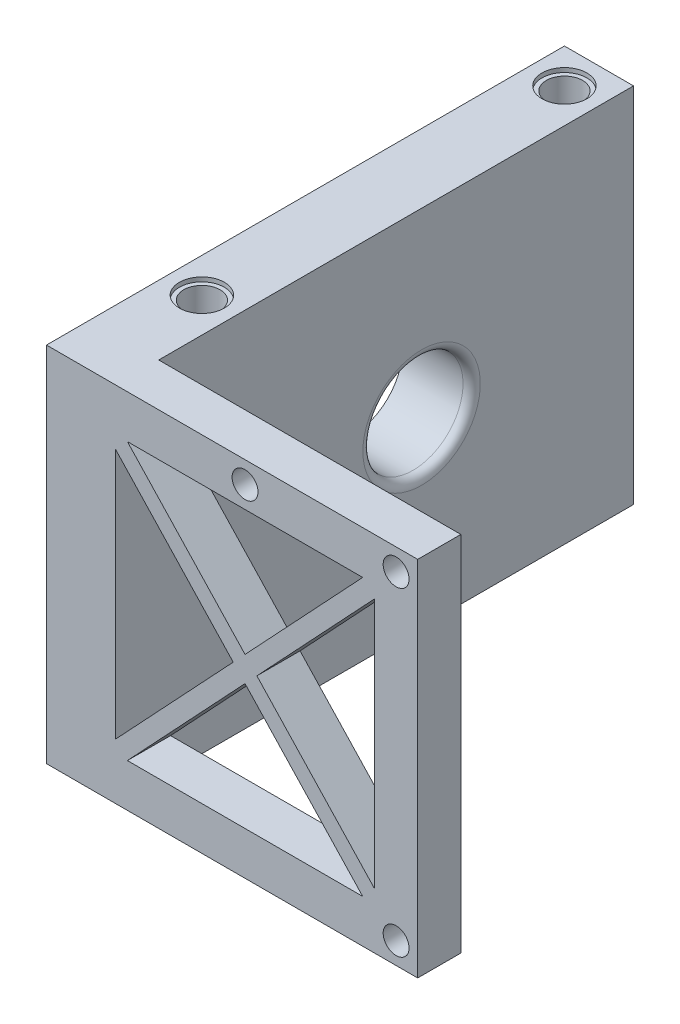
ISO-10303-21;
HEADER;
FILE_DESCRIPTION(('STEP AP214'),'2;1');
FILE_NAME('part.step','',(''),(''),'','','');
FILE_SCHEMA(('AUTOMOTIVE_DESIGN { 1 0 10303 214 1 1 1 1 }'));
ENDSEC;
DATA;
#1=APPLICATION_CONTEXT('core data for automotive mechanical design processes');
#2=APPLICATION_PROTOCOL_DEFINITION('international standard','automotive_design',2000,#1);
#3=PRODUCT_CONTEXT('',#1,'mechanical');
#4=PRODUCT('Part','Part','',(#3));
#5=PRODUCT_RELATED_PRODUCT_CATEGORY('part','',(#4));
#6=PRODUCT_DEFINITION_FORMATION('','',#4);
#7=PRODUCT_DEFINITION_CONTEXT('part definition',#1,'design');
#8=PRODUCT_DEFINITION('design','',#6,#7);
#9=PRODUCT_DEFINITION_SHAPE('','',#8);
#10=(LENGTH_UNIT() NAMED_UNIT(*) SI_UNIT(.MILLI.,.METRE.));
#11=(NAMED_UNIT(*) PLANE_ANGLE_UNIT() SI_UNIT($,.RADIAN.));
#12=(NAMED_UNIT(*) SI_UNIT($,.STERADIAN.) SOLID_ANGLE_UNIT());
#13=UNCERTAINTY_MEASURE_WITH_UNIT(LENGTH_MEASURE(1.E-05),#10,'distance_accuracy_value','');
#14=(GEOMETRIC_REPRESENTATION_CONTEXT(3) GLOBAL_UNCERTAINTY_ASSIGNED_CONTEXT((#13)) GLOBAL_UNIT_ASSIGNED_CONTEXT((#10,
#11,#12)) REPRESENTATION_CONTEXT('',''));
#15=CARTESIAN_POINT('',(0.,0.,0.));
#16=DIRECTION('',(0.,0.,1.));
#17=DIRECTION('',(1.,0.,0.));
#18=AXIS2_PLACEMENT_3D('',#15,#16,#17);
#19=CARTESIAN_POINT('',(0.,0.,23.6152416356877));
#20=DIRECTION('',(0.,0.,1.));
#21=DIRECTION('',(1.,0.,0.));
#22=AXIS2_PLACEMENT_3D('',#19,#20,#21);
#23=PLANE('',#22);
#24=CARTESIAN_POINT('',(4.77695167286246,-2.5,23.6152416356877));
#25=DIRECTION('',(0.,0.,1.));
#26=DIRECTION('',(1.,0.,0.));
#27=AXIS2_PLACEMENT_3D('',#24,#25,#26);
#28=CIRCLE('',#27,1.5);
#29=CARTESIAN_POINT('',(6.27695167286246,-2.5,23.6152416356877));
#30=VERTEX_POINT('',#29);
#31=EDGE_CURVE('E675',#30,#30,#28,.T.);
#32=ORIENTED_EDGE('',*,*,#31,.F.);
#33=EDGE_LOOP('',(#32));
#34=FACE_BOUND('',#33,.T.);
#35=CARTESIAN_POINT('',(22.2769516728625,-39.5,23.6152416356877));
#36=DIRECTION('',(0.,0.,1.));
#37=DIRECTION('',(1.,0.,0.));
#38=AXIS2_PLACEMENT_3D('',#35,#36,#37);
#39=CIRCLE('',#38,1.5);
#40=CARTESIAN_POINT('',(23.7769516728625,-39.5,23.6152416356877));
#41=VERTEX_POINT('',#40);
#42=EDGE_CURVE('E673',#41,#41,#39,.T.);
#43=ORIENTED_EDGE('',*,*,#42,.F.);
#44=EDGE_LOOP('',(#43));
#45=FACE_BOUND('',#44,.T.);
#46=CARTESIAN_POINT('',(22.2769516728625,-2.5,23.6152416356877));
#47=DIRECTION('',(0.,0.,1.));
#48=DIRECTION('',(1.,0.,0.));
#49=AXIS2_PLACEMENT_3D('',#46,#47,#48);
#50=CIRCLE('',#49,1.5);
#51=CARTESIAN_POINT('',(23.7769516728625,-2.5,23.6152416356877));
#52=VERTEX_POINT('',#51);
#53=EDGE_CURVE('E280',#52,#52,#50,.T.);
#54=ORIENTED_EDGE('',*,*,#53,.F.);
#55=EDGE_LOOP('',(#54));
#56=FACE_BOUND('',#55,.T.);
#57=DIRECTION('',(1.,0.,0.));
#58=VECTOR('',#57,1.);
#59=CARTESIAN_POINT('',(-10.2230483271376,-42.,23.6152416356877));
#60=LINE('',#59,#58);
#61=CARTESIAN_POINT('',(-18.2230483271375,-42.,23.6152416356877));
#62=VERTEX_POINT('',#61);
#63=CARTESIAN_POINT('',(24.7769516728625,-42.,23.6152416356877));
#64=VERTEX_POINT('',#63);
#65=EDGE_CURVE('E414',#62,#64,#60,.T.);
#66=ORIENTED_EDGE('',*,*,#65,.T.);
#67=DIRECTION('',(0.,-1.,0.));
#68=VECTOR('',#67,1.);
#69=CARTESIAN_POINT('',(24.7769516728625,0.,23.6152416356877));
#70=LINE('',#69,#68);
#71=CARTESIAN_POINT('',(24.7769516728625,0.,23.6152416356877));
#72=VERTEX_POINT('',#71);
#73=EDGE_CURVE('E381',#72,#64,#70,.T.);
#74=ORIENTED_EDGE('',*,*,#73,.F.);
#75=DIRECTION('',(-1.,0.,0.));
#76=VECTOR('',#75,1.);
#77=CARTESIAN_POINT('',(-10.2230483271376,0.,23.6152416356877));
#78=LINE('',#77,#76);
#79=CARTESIAN_POINT('',(-18.2230483271375,0.,23.6152416356877));
#80=VERTEX_POINT('',#79);
#81=EDGE_CURVE('E406',#72,#80,#78,.T.);
#82=ORIENTED_EDGE('',*,*,#81,.T.);
#83=DIRECTION('',(0.,-1.,0.));
#84=VECTOR('',#83,1.);
#85=CARTESIAN_POINT('',(-18.2230483271375,-42.,23.6152416356877));
#86=LINE('',#85,#84);
#87=EDGE_CURVE('E410',#80,#62,#86,.T.);
#88=ORIENTED_EDGE('',*,*,#87,.T.);
#89=EDGE_LOOP('',(#66,#74,#82,#88));
#90=FACE_BOUND('',#89,.T.);
#91=DIRECTION('',(0.68394112888133,-0.729537204140085,0.));
#92=VECTOR('',#91,1.);
#93=CARTESIAN_POINT('',(-8.66529681276215,-8.12371576196452,23.6152416356877));
#94=LINE('',#93,#92);
#95=CARTESIAN_POINT('',(-10.2230483271376,-6.46211414663075,23.6152416356877));
#96=VERTEX_POINT('',#95);
#97=CARTESIAN_POINT('',(3.40621966039612,-21.,23.6152416356877));
#98=VERTEX_POINT('',#97);
#99=EDGE_CURVE('E364',#96,#98,#94,.T.);
#100=ORIENTED_EDGE('',*,*,#99,.T.);
#101=DIRECTION('',(-0.68394112888133,-0.729537204140085,0.));
#102=VECTOR('',#101,1.);
#103=CARTESIAN_POINT('',(12.2910441435788,-11.5228538846051,23.6152416356877));
#104=LINE('',#103,#102);
#105=CARTESIAN_POINT('',(-10.2230483271375,-35.5378858533693,23.6152416356877));
#106=VERTEX_POINT('',#105);
#107=EDGE_CURVE('E347',#98,#106,#104,.T.);
#108=ORIENTED_EDGE('',*,*,#107,.T.);
#109=DIRECTION('',(0.,-1.,0.));
#110=VECTOR('',#109,1.);
#111=CARTESIAN_POINT('',(-10.2230483271376,0.,23.6152416356877));
#112=LINE('',#111,#110);
#113=EDGE_CURVE('E357',#96,#106,#112,.T.);
#114=ORIENTED_EDGE('',*,*,#113,.F.);
#115=EDGE_LOOP('',(#100,#108,#114));
#116=FACE_BOUND('',#115,.T.);
#117=DIRECTION('',(0.68394112888133,0.729537204140085,0.));
#118=VECTOR('',#117,1.);
#119=CARTESIAN_POINT('',(13.750118551859,-12.8907361423678,23.6152416356877));
#120=LINE('',#119,#118);
#121=CARTESIAN_POINT('',(-8.85231631467122,-37.,23.6152416356877));
#122=VERTEX_POINT('',#121);
#123=CARTESIAN_POINT('',(4.77695167286245,-22.4621141466308,23.6152416356877));
#124=VERTEX_POINT('',#123);
#125=EDGE_CURVE('E277',#122,#124,#120,.T.);
#126=ORIENTED_EDGE('',*,*,#125,.T.);
#127=DIRECTION('',(0.68394112888133,-0.729537204140085,0.));
#128=VECTOR('',#127,1.);
#129=CARTESIAN_POINT('',(-8.66529681276215,-8.12371576196451,23.6152416356877));
#130=LINE('',#129,#128);
#131=CARTESIAN_POINT('',(18.4062196603961,-37.,23.6152416356877));
#132=VERTEX_POINT('',#131);
#133=EDGE_CURVE('E267',#124,#132,#130,.T.);
#134=ORIENTED_EDGE('',*,*,#133,.T.);
#135=DIRECTION('',(1.,0.,0.));
#136=VECTOR('',#135,1.);
#137=CARTESIAN_POINT('',(0.,-37.,23.6152416356877));
#138=LINE('',#137,#136);
#139=EDGE_CURVE('E273',#122,#132,#138,.T.);
#140=ORIENTED_EDGE('',*,*,#139,.F.);
#141=EDGE_LOOP('',(#126,#134,#140));
#142=FACE_BOUND('',#141,.T.);
#143=DIRECTION('',(-0.68394112888133,-0.729537204140085,0.));
#144=VECTOR('',#143,1.);
#145=CARTESIAN_POINT('',(12.2910441435788,-11.5228538846051,23.6152416356877));
#146=LINE('',#145,#144);
#147=CARTESIAN_POINT('',(18.4062196603961,-5.,23.6152416356877));
#148=VERTEX_POINT('',#147);
#149=CARTESIAN_POINT('',(4.77695167286246,-19.5378858533692,23.6152416356877));
#150=VERTEX_POINT('',#149);
#151=EDGE_CURVE('E337',#148,#150,#146,.T.);
#152=ORIENTED_EDGE('',*,*,#151,.T.);
#153=DIRECTION('',(-0.68394112888133,0.729537204140085,0.));
#154=VECTOR('',#153,1.);
#155=CARTESIAN_POINT('',(-7.20622240448198,-6.75583350420185,23.6152416356877));
#156=LINE('',#155,#154);
#157=CARTESIAN_POINT('',(-8.85231631467122,-5.,23.6152416356877));
#158=VERTEX_POINT('',#157);
#159=EDGE_CURVE('E142',#150,#158,#156,.T.);
#160=ORIENTED_EDGE('',*,*,#159,.T.);
#161=DIRECTION('',(1.,0.,0.));
#162=VECTOR('',#161,1.);
#163=CARTESIAN_POINT('',(0.,-5.,23.6152416356877));
#164=LINE('',#163,#162);
#165=EDGE_CURVE('E327',#158,#148,#164,.T.);
#166=ORIENTED_EDGE('',*,*,#165,.T.);
#167=EDGE_LOOP('',(#152,#160,#166));
#168=FACE_BOUND('',#167,.T.);
#169=DIRECTION('',(-0.68394112888133,0.729537204140085,0.));
#170=VECTOR('',#169,1.);
#171=CARTESIAN_POINT('',(-7.20622240448198,-6.75583350420185,23.6152416356877));
#172=LINE('',#171,#170);
#173=CARTESIAN_POINT('',(19.7769516728625,-35.5378858533693,23.6152416356877));
#174=VERTEX_POINT('',#173);
#175=CARTESIAN_POINT('',(6.14768368532878,-21.,23.6152416356877));
#176=VERTEX_POINT('',#175);
#177=EDGE_CURVE('E308',#174,#176,#172,.T.);
#178=ORIENTED_EDGE('',*,*,#177,.T.);
#179=DIRECTION('',(0.68394112888133,0.729537204140085,0.));
#180=VECTOR('',#179,1.);
#181=CARTESIAN_POINT('',(13.750118551859,-12.8907361423678,23.6152416356877));
#182=LINE('',#181,#180);
#183=CARTESIAN_POINT('',(19.7769516728625,-6.46211414663076,23.6152416356877));
#184=VERTEX_POINT('',#183);
#185=EDGE_CURVE('E134',#176,#184,#182,.T.);
#186=ORIENTED_EDGE('',*,*,#185,.T.);
#187=DIRECTION('',(0.,-1.,0.));
#188=VECTOR('',#187,1.);
#189=CARTESIAN_POINT('',(19.7769516728625,0.,23.6152416356877));
#190=LINE('',#189,#188);
#191=EDGE_CURVE('E298',#184,#174,#190,.T.);
#192=ORIENTED_EDGE('',*,*,#191,.T.);
#193=EDGE_LOOP('',(#178,#186,#192));
#194=FACE_BOUND('',#193,.T.);
#195=ADVANCED_FACE('F117',(#34,#45,#56,#90,#116,#142,#168,#194),#23,.T.);
#196=CARTESIAN_POINT('',(24.7769516728625,0.,18.6152416356877));
#197=DIRECTION('',(0.,0.,1.));
#198=DIRECTION('',(0.,-1.,0.));
#199=AXIS2_PLACEMENT_3D('',#196,#197,#198);
#200=PLANE('',#199);
#201=CARTESIAN_POINT('',(22.2769516728625,-39.5,18.6152416356877));
#202=DIRECTION('',(0.,0.,1.));
#203=DIRECTION('',(0.,-1.,0.));
#204=AXIS2_PLACEMENT_3D('',#201,#202,#203);
#205=CIRCLE('',#204,2.00000000000001);
#206=CARTESIAN_POINT('',(22.2769516728625,-41.5,18.6152416356877));
#207=VERTEX_POINT('',#206);
#208=EDGE_CURVE('E514',#207,#207,#205,.T.);
#209=ORIENTED_EDGE('',*,*,#208,.T.);
#210=EDGE_LOOP('',(#209));
#211=FACE_BOUND('',#210,.T.);
#212=CARTESIAN_POINT('',(4.77695167286246,-2.5,18.6152416356877));
#213=DIRECTION('',(0.,0.,1.));
#214=DIRECTION('',(0.,-1.,0.));
#215=AXIS2_PLACEMENT_3D('',#212,#213,#214);
#216=CIRCLE('',#215,2.00000000000003);
#217=CARTESIAN_POINT('',(4.77695167286246,-4.50000000000003,18.6152416356877));
#218=VERTEX_POINT('',#217);
#219=EDGE_CURVE('E510',#218,#218,#216,.T.);
#220=ORIENTED_EDGE('',*,*,#219,.T.);
#221=EDGE_LOOP('',(#220));
#222=FACE_BOUND('',#221,.T.);
#223=CARTESIAN_POINT('',(22.2769516728625,-2.5,18.6152416356877));
#224=DIRECTION('',(0.,0.,1.));
#225=DIRECTION('',(0.,-1.,0.));
#226=AXIS2_PLACEMENT_3D('',#223,#224,#225);
#227=CIRCLE('',#226,2.00000000000002);
#228=CARTESIAN_POINT('',(22.2769516728625,-4.50000000000002,18.6152416356877));
#229=VERTEX_POINT('',#228);
#230=EDGE_CURVE('E500',#229,#229,#227,.T.);
#231=ORIENTED_EDGE('',*,*,#230,.T.);
#232=EDGE_LOOP('',(#231));
#233=FACE_BOUND('',#232,.T.);
#234=DIRECTION('',(-0.68394112888133,0.729537204140085,0.));
#235=VECTOR('',#234,1.);
#236=CARTESIAN_POINT('',(-7.20622240448198,-6.75583350420185,18.6152416356877));
#237=LINE('',#236,#235);
#238=CARTESIAN_POINT('',(4.77695167286246,-19.5378858533692,18.6152416356877));
#239=VERTEX_POINT('',#238);
#240=CARTESIAN_POINT('',(-8.85231631467122,-5.,18.6152416356877));
#241=VERTEX_POINT('',#240);
#242=EDGE_CURVE('E323',#239,#241,#237,.T.);
#243=ORIENTED_EDGE('',*,*,#242,.F.);
#244=DIRECTION('',(-0.68394112888133,-0.729537204140085,0.));
#245=VECTOR('',#244,1.);
#246=CARTESIAN_POINT('',(12.2910441435788,-11.5228538846051,18.6152416356877));
#247=LINE('',#246,#245);
#248=CARTESIAN_POINT('',(18.4062196603961,-5.,18.6152416356877));
#249=VERTEX_POINT('',#248);
#250=EDGE_CURVE('E326',#249,#239,#247,.T.);
#251=ORIENTED_EDGE('',*,*,#250,.F.);
#252=DIRECTION('',(1.,0.,0.));
#253=VECTOR('',#252,1.);
#254=CARTESIAN_POINT('',(0.,-5.,18.6152416356877));
#255=LINE('',#254,#253);
#256=EDGE_CURVE('E330',#241,#249,#255,.T.);
#257=ORIENTED_EDGE('',*,*,#256,.F.);
#258=EDGE_LOOP('',(#243,#251,#257));
#259=FACE_BOUND('',#258,.T.);
#260=DIRECTION('',(-0.68394112888133,-0.729537204140085,0.));
#261=VECTOR('',#260,1.);
#262=CARTESIAN_POINT('',(12.2910441435788,-11.5228538846051,18.6152416356877));
#263=LINE('',#262,#261);
#264=CARTESIAN_POINT('',(3.40621966039612,-21.,18.6152416356877));
#265=VERTEX_POINT('',#264);
#266=CARTESIAN_POINT('',(-10.2230483271375,-35.5378858533693,18.6152416356877));
#267=VERTEX_POINT('',#266);
#268=EDGE_CURVE('E353',#265,#267,#263,.T.);
#269=ORIENTED_EDGE('',*,*,#268,.F.);
#270=DIRECTION('',(0.68394112888133,-0.729537204140085,0.));
#271=VECTOR('',#270,1.);
#272=CARTESIAN_POINT('',(-8.66529681276215,-8.12371576196452,18.6152416356877));
#273=LINE('',#272,#271);
#274=CARTESIAN_POINT('',(-10.2230483271376,-6.46211414663074,18.6152416356877));
#275=VERTEX_POINT('',#274);
#276=EDGE_CURVE('E356',#275,#265,#273,.T.);
#277=ORIENTED_EDGE('',*,*,#276,.F.);
#278=DIRECTION('',(0.,1.,0.));
#279=VECTOR('',#278,1.);
#280=CARTESIAN_POINT('',(-10.2230483271376,0.,18.6152416356877));
#281=LINE('',#280,#279);
#282=CARTESIAN_POINT('',(-10.2230483271376,0.,18.6152416356877));
#283=VERTEX_POINT('',#282);
#284=EDGE_CURVE('E374',#275,#283,#281,.T.);
#285=ORIENTED_EDGE('',*,*,#284,.T.);
#286=DIRECTION('',(-1.,0.,0.));
#287=VECTOR('',#286,1.);
#288=CARTESIAN_POINT('',(24.7769516728625,0.,18.6152416356877));
#289=LINE('',#288,#287);
#290=CARTESIAN_POINT('',(24.7769516728625,0.,18.6152416356877));
#291=VERTEX_POINT('',#290);
#292=EDGE_CURVE('E396',#291,#283,#289,.T.);
#293=ORIENTED_EDGE('',*,*,#292,.F.);
#294=DIRECTION('',(0.,1.,0.));
#295=VECTOR('',#294,1.);
#296=CARTESIAN_POINT('',(24.7769516728625,0.,18.6152416356877));
#297=LINE('',#296,#295);
#298=CARTESIAN_POINT('',(24.7769516728625,-42.,18.6152416356877));
#299=VERTEX_POINT('',#298);
#300=EDGE_CURVE('E389',#299,#291,#297,.T.);
#301=ORIENTED_EDGE('',*,*,#300,.F.);
#302=DIRECTION('',(-1.,0.,0.));
#303=VECTOR('',#302,1.);
#304=CARTESIAN_POINT('',(24.7769516728625,-42.,18.6152416356877));
#305=LINE('',#304,#303);
#306=CARTESIAN_POINT('',(-10.2230483271376,-42.,18.6152416356877));
#307=VERTEX_POINT('',#306);
#308=EDGE_CURVE('E403',#299,#307,#305,.T.);
#309=ORIENTED_EDGE('',*,*,#308,.T.);
#310=EDGE_CURVE('E386',#307,#267,#281,.T.);
#311=ORIENTED_EDGE('',*,*,#310,.T.);
#312=EDGE_LOOP('',(#269,#277,#285,#293,#301,#309,#311));
#313=FACE_BOUND('',#312,.T.);
#314=DIRECTION('',(0.68394112888133,-0.729537204140085,0.));
#315=VECTOR('',#314,1.);
#316=CARTESIAN_POINT('',(-8.66529681276215,-8.12371576196451,18.6152416356877));
#317=LINE('',#316,#315);
#318=CARTESIAN_POINT('',(4.77695167286245,-22.4621141466308,18.6152416356877));
#319=VERTEX_POINT('',#318);
#320=CARTESIAN_POINT('',(18.4062196603961,-37.,18.6152416356877));
#321=VERTEX_POINT('',#320);
#322=EDGE_CURVE('E261',#319,#321,#317,.T.);
#323=ORIENTED_EDGE('',*,*,#322,.F.);
#324=DIRECTION('',(0.68394112888133,0.729537204140085,0.));
#325=VECTOR('',#324,1.);
#326=CARTESIAN_POINT('',(13.750118551859,-12.8907361423678,18.6152416356877));
#327=LINE('',#326,#325);
#328=CARTESIAN_POINT('',(-8.85231631467122,-37.,18.6152416356877));
#329=VERTEX_POINT('',#328);
#330=EDGE_CURVE('E249',#329,#319,#327,.T.);
#331=ORIENTED_EDGE('',*,*,#330,.F.);
#332=DIRECTION('',(1.,0.,0.));
#333=VECTOR('',#332,1.);
#334=CARTESIAN_POINT('',(0.,-37.,18.6152416356877));
#335=LINE('',#334,#333);
#336=EDGE_CURVE('E260',#329,#321,#335,.T.);
#337=ORIENTED_EDGE('',*,*,#336,.T.);
#338=EDGE_LOOP('',(#323,#331,#337));
#339=FACE_BOUND('',#338,.T.);
#340=DIRECTION('',(0.68394112888133,0.729537204140085,0.));
#341=VECTOR('',#340,1.);
#342=CARTESIAN_POINT('',(13.750118551859,-12.8907361423678,18.6152416356877));
#343=LINE('',#342,#341);
#344=CARTESIAN_POINT('',(6.14768368532878,-21.,18.6152416356877));
#345=VERTEX_POINT('',#344);
#346=CARTESIAN_POINT('',(19.7769516728625,-6.46211414663076,18.6152416356877));
#347=VERTEX_POINT('',#346);
#348=EDGE_CURVE('E294',#345,#347,#343,.T.);
#349=ORIENTED_EDGE('',*,*,#348,.F.);
#350=DIRECTION('',(-0.68394112888133,0.729537204140085,0.));
#351=VECTOR('',#350,1.);
#352=CARTESIAN_POINT('',(-7.20622240448198,-6.75583350420185,18.6152416356877));
#353=LINE('',#352,#351);
#354=CARTESIAN_POINT('',(19.7769516728625,-35.5378858533693,18.6152416356877));
#355=VERTEX_POINT('',#354);
#356=EDGE_CURVE('E297',#355,#345,#353,.T.);
#357=ORIENTED_EDGE('',*,*,#356,.F.);
#358=DIRECTION('',(0.,-1.,0.));
#359=VECTOR('',#358,1.);
#360=CARTESIAN_POINT('',(19.7769516728625,0.,18.6152416356877));
#361=LINE('',#360,#359);
#362=EDGE_CURVE('E301',#347,#355,#361,.T.);
#363=ORIENTED_EDGE('',*,*,#362,.F.);
#364=EDGE_LOOP('',(#349,#357,#363));
#365=FACE_BOUND('',#364,.T.);
#366=ADVANCED_FACE('F270',(#211,#222,#233,#259,#313,#339,#365),#200,.F.);
#367=CARTESIAN_POINT('',(-10.2230483271376,-42.,-36.3847583643123));
#368=DIRECTION('',(-1.,0.,0.));
#369=DIRECTION('',(0.,0.,1.));
#370=AXIS2_PLACEMENT_3D('',#367,#368,#369);
#371=PLANE('',#370);
#372=CARTESIAN_POINT('',(-10.2230483271376,-21.,-11.836279123996));
#373=DIRECTION('',(-1.,0.,0.));
#374=DIRECTION('',(0.,0.,1.));
#375=AXIS2_PLACEMENT_3D('',#372,#373,#374);
#376=CIRCLE('',#375,6.80237020535575);
#377=CARTESIAN_POINT('',(-10.2230483271376,-21.,-5.03390891864026));
#378=VERTEX_POINT('',#377);
#379=EDGE_CURVE('E492',#378,#378,#376,.T.);
#380=ORIENTED_EDGE('',*,*,#379,.T.);
#381=EDGE_LOOP('',(#380));
#382=FACE_BOUND('',#381,.T.);
#383=ORIENTED_EDGE('',*,*,#310,.F.);
#384=DIRECTION('',(0.,0.,1.));
#385=VECTOR('',#384,1.);
#386=CARTESIAN_POINT('',(-10.2230483271376,-42.,-36.3847583643123));
#387=LINE('',#386,#385);
#388=CARTESIAN_POINT('',(-10.2230483271376,-42.,-36.3847583643123));
#389=VERTEX_POINT('',#388);
#390=EDGE_CURVE('E478',#389,#307,#387,.T.);
#391=ORIENTED_EDGE('',*,*,#390,.F.);
#392=DIRECTION('',(0.,1.,0.));
#393=VECTOR('',#392,1.);
#394=CARTESIAN_POINT('',(-10.2230483271376,-42.,-36.3847583643123));
#395=LINE('',#394,#393);
#396=CARTESIAN_POINT('',(-10.2230483271376,0.,-36.3847583643123));
#397=VERTEX_POINT('',#396);
#398=EDGE_CURVE('E482',#389,#397,#395,.T.);
#399=ORIENTED_EDGE('',*,*,#398,.T.);
#400=DIRECTION('',(0.,0.,1.));
#401=VECTOR('',#400,1.);
#402=CARTESIAN_POINT('',(-10.2230483271376,0.,-36.3847583643123));
#403=LINE('',#402,#401);
#404=EDGE_CURVE('E459',#397,#283,#403,.T.);
#405=ORIENTED_EDGE('',*,*,#404,.T.);
#406=ORIENTED_EDGE('',*,*,#284,.F.);
#407=DIRECTION('',(0.,0.,1.));
#408=VECTOR('',#407,1.);
#409=CARTESIAN_POINT('',(-10.2230483271376,-6.46211414663075,18.6152416356877));
#410=LINE('',#409,#408);
#411=EDGE_CURVE('E375',#275,#96,#410,.T.);
#412=ORIENTED_EDGE('',*,*,#411,.T.);
#413=ORIENTED_EDGE('',*,*,#113,.T.);
#414=DIRECTION('',(0.,0.,1.));
#415=VECTOR('',#414,1.);
#416=CARTESIAN_POINT('',(-10.2230483271375,-35.5378858533693,18.6152416356877));
#417=LINE('',#416,#415);
#418=EDGE_CURVE('E371',#267,#106,#417,.T.);
#419=ORIENTED_EDGE('',*,*,#418,.F.);
#420=EDGE_LOOP('',(#383,#391,#399,#405,#406,#412,#413,#419));
#421=FACE_BOUND('',#420,.T.);
#422=ADVANCED_FACE('F536',(#382,#421),#371,.F.);
#423=CARTESIAN_POINT('',(-14.2230483271375,-42.,-32.3847583643123));
#424=DIRECTION('',(0.,1.,0.));
#425=DIRECTION('',(0.,0.,1.));
#426=AXIS2_PLACEMENT_3D('',#423,#424,#425);
#427=CYLINDRICAL_SURFACE('',#426,2.1);
#428=CARTESIAN_POINT('',(-14.2230483271375,-41.5,-32.3847583643123));
#429=DIRECTION('',(0.,-1.,0.));
#430=DIRECTION('',(0.,0.,-1.));
#431=AXIS2_PLACEMENT_3D('',#428,#429,#430);
#432=CIRCLE('',#431,2.1);
#433=CARTESIAN_POINT('',(-14.2230483271375,-41.5,-34.4847583643123));
#434=VERTEX_POINT('',#433);
#435=EDGE_CURVE('E439',#434,#434,#432,.T.);
#436=ORIENTED_EDGE('',*,*,#435,.T.);
#437=EDGE_LOOP('',(#436));
#438=FACE_BOUND('',#437,.T.);
#439=CARTESIAN_POINT('',(-14.2230483271375,-0.5,-32.3847583643123));
#440=DIRECTION('',(0.,1.,0.));
#441=DIRECTION('',(0.,0.,1.));
#442=AXIS2_PLACEMENT_3D('',#439,#440,#441);
#443=CIRCLE('',#442,2.1);
#444=CARTESIAN_POINT('',(-14.2230483271375,-0.5,-30.2847583643123));
#445=VERTEX_POINT('',#444);
#446=EDGE_CURVE('E422',#445,#445,#443,.F.);
#447=ORIENTED_EDGE('',*,*,#446,.F.);
#448=EDGE_LOOP('',(#447));
#449=FACE_BOUND('',#448,.T.);
#450=ADVANCED_FACE('F602',(#438,#449),#427,.F.);
#451=CARTESIAN_POINT('',(-14.2230483271375,-42.,9.61524163568774));
#452=DIRECTION('',(0.,1.,0.));
#453=DIRECTION('',(0.,0.,1.));
#454=AXIS2_PLACEMENT_3D('',#451,#452,#453);
#455=CYLINDRICAL_SURFACE('',#454,2.1);
#456=CARTESIAN_POINT('',(-14.2230483271375,-41.5,9.61524163568774));
#457=DIRECTION('',(0.,-1.,0.));
#458=DIRECTION('',(0.,0.,-1.));
#459=AXIS2_PLACEMENT_3D('',#456,#457,#458);
#460=CIRCLE('',#459,2.1);
#461=CARTESIAN_POINT('',(-14.2230483271375,-41.5,7.51524163568774));
#462=VERTEX_POINT('',#461);
#463=EDGE_CURVE('E435',#462,#462,#460,.F.);
#464=ORIENTED_EDGE('',*,*,#463,.F.);
#465=EDGE_LOOP('',(#464));
#466=FACE_BOUND('',#465,.T.);
#467=CARTESIAN_POINT('',(-14.2230483271375,-0.5,9.61524163568774));
#468=DIRECTION('',(0.,1.,0.));
#469=DIRECTION('',(0.,0.,1.));
#470=AXIS2_PLACEMENT_3D('',#467,#468,#469);
#471=CIRCLE('',#470,2.1);
#472=CARTESIAN_POINT('',(-14.2230483271375,-0.5,11.7152416356877));
#473=VERTEX_POINT('',#472);
#474=EDGE_CURVE('E430',#473,#473,#471,.T.);
#475=ORIENTED_EDGE('',*,*,#474,.T.);
#476=EDGE_LOOP('',(#475));
#477=FACE_BOUND('',#476,.T.);
#478=ADVANCED_FACE('F598',(#466,#477),#455,.F.);
#479=CARTESIAN_POINT('',(-10.2230483271376,3.,-36.3847583643123));
#480=DIRECTION('',(0.,0.,1.));
#481=DIRECTION('',(1.,0.,0.));
#482=AXIS2_PLACEMENT_3D('',#479,#480,#481);
#483=PLANE('',#482);
#484=DIRECTION('',(0.,-1.,0.));
#485=VECTOR('',#484,1.);
#486=CARTESIAN_POINT('',(-18.2230483271376,3.,-36.3847583643123));
#487=LINE('',#486,#485);
#488=CARTESIAN_POINT('',(-18.2230483271376,0.,-36.3847583643123));
#489=VERTEX_POINT('',#488);
#490=CARTESIAN_POINT('',(-18.2230483271376,-42.,-36.3847583643123));
#491=VERTEX_POINT('',#490);
#492=EDGE_CURVE('E489',#489,#491,#487,.T.);
#493=ORIENTED_EDGE('',*,*,#492,.F.);
#494=DIRECTION('',(1.,0.,0.));
#495=VECTOR('',#494,1.);
#496=CARTESIAN_POINT('',(14.7769516728625,0.,-36.3847583643123));
#497=LINE('',#496,#495);
#498=EDGE_CURVE('E443',#489,#397,#497,.T.);
#499=ORIENTED_EDGE('',*,*,#498,.T.);
#500=ORIENTED_EDGE('',*,*,#398,.F.);
#501=DIRECTION('',(1.,0.,0.));
#502=VECTOR('',#501,1.);
#503=CARTESIAN_POINT('',(-18.2230483271376,-42.,-36.3847583643123));
#504=LINE('',#503,#502);
#505=EDGE_CURVE('E475',#491,#389,#504,.T.);
#506=ORIENTED_EDGE('',*,*,#505,.F.);
#507=EDGE_LOOP('',(#493,#499,#500,#506));
#508=FACE_BOUND('',#507,.T.);
#509=ADVANCED_FACE('F601',(#508),#483,.F.);
#510=CARTESIAN_POINT('',(-18.2230483271375,0.,0.));
#511=DIRECTION('',(-1.,0.,0.));
#512=DIRECTION('',(0.,0.,1.));
#513=AXIS2_PLACEMENT_3D('',#510,#511,#512);
#514=PLANE('',#513);
#515=DIRECTION('',(0.,0.,1.));
#516=VECTOR('',#515,1.);
#517=CARTESIAN_POINT('',(-18.2230483271375,0.,0.));
#518=LINE('',#517,#516);
#519=EDGE_CURVE('E447',#489,#80,#518,.T.);
#520=ORIENTED_EDGE('',*,*,#519,.F.);
#521=ORIENTED_EDGE('',*,*,#492,.T.);
#522=DIRECTION('',(0.,0.,-1.));
#523=VECTOR('',#522,1.);
#524=CARTESIAN_POINT('',(-18.2230483271376,-42.,-36.3847583643123));
#525=LINE('',#524,#523);
#526=EDGE_CURVE('E471',#62,#491,#525,.T.);
#527=ORIENTED_EDGE('',*,*,#526,.F.);
#528=ORIENTED_EDGE('',*,*,#87,.F.);
#529=EDGE_LOOP('',(#520,#521,#527,#528));
#530=FACE_BOUND('',#529,.T.);
#531=CARTESIAN_POINT('',(-18.2230483271375,-21.,-11.836279123996));
#532=DIRECTION('',(-1.,0.,0.));
#533=DIRECTION('',(0.,0.,1.));
#534=AXIS2_PLACEMENT_3D('',#531,#532,#533);
#535=CIRCLE('',#534,5.80237020535575);
#536=CARTESIAN_POINT('',(-18.2230483271375,-21.,-6.03390891864026));
#537=VERTEX_POINT('',#536);
#538=EDGE_CURVE('E450',#537,#537,#535,.T.);
#539=ORIENTED_EDGE('',*,*,#538,.F.);
#540=EDGE_LOOP('',(#539));
#541=FACE_BOUND('',#540,.T.);
#542=ADVANCED_FACE('F634',(#530,#541),#514,.T.);
#543=CARTESIAN_POINT('',(0.,-42.,0.));
#544=DIRECTION('',(0.,1.,0.));
#545=DIRECTION('',(0.,0.,1.));
#546=AXIS2_PLACEMENT_3D('',#543,#544,#545);
#547=PLANE('',#546);
#548=CARTESIAN_POINT('',(-14.2230483271375,-42.,-32.3847583643123));
#549=DIRECTION('',(0.,1.,0.));
#550=DIRECTION('',(0.,0.,1.));
#551=AXIS2_PLACEMENT_3D('',#548,#549,#550);
#552=CIRCLE('',#551,2.65);
#553=CARTESIAN_POINT('',(-14.2230483271375,-42.,-29.7347583643123));
#554=VERTEX_POINT('',#553);
#555=EDGE_CURVE('E460',#554,#554,#552,.T.);
#556=ORIENTED_EDGE('',*,*,#555,.T.);
#557=EDGE_LOOP('',(#556));
#558=FACE_BOUND('',#557,.T.);
#559=CARTESIAN_POINT('',(-14.2230483271375,-42.,9.61524163568773));
#560=DIRECTION('',(0.,1.,0.));
#561=DIRECTION('',(0.,0.,1.));
#562=AXIS2_PLACEMENT_3D('',#559,#560,#561);
#563=CIRCLE('',#562,2.65);
#564=CARTESIAN_POINT('',(-14.2230483271375,-42.,12.2652416356877));
#565=VERTEX_POINT('',#564);
#566=EDGE_CURVE('E454',#565,#565,#563,.T.);
#567=ORIENTED_EDGE('',*,*,#566,.T.);
#568=EDGE_LOOP('',(#567));
#569=FACE_BOUND('',#568,.T.);
#570=ORIENTED_EDGE('',*,*,#526,.T.);
#571=ORIENTED_EDGE('',*,*,#505,.T.);
#572=ORIENTED_EDGE('',*,*,#390,.T.);
#573=ORIENTED_EDGE('',*,*,#308,.F.);
#574=DIRECTION('',(0.,0.,-1.));
#575=VECTOR('',#574,1.);
#576=CARTESIAN_POINT('',(24.7769516728625,-42.,23.6152416356877));
#577=LINE('',#576,#575);
#578=EDGE_CURVE('E385',#64,#299,#577,.T.);
#579=ORIENTED_EDGE('',*,*,#578,.F.);
#580=ORIENTED_EDGE('',*,*,#65,.F.);
#581=EDGE_LOOP('',(#570,#571,#572,#573,#579,#580));
#582=FACE_BOUND('',#581,.T.);
#583=ADVANCED_FACE('F630',(#558,#569,#582),#547,.F.);
#584=CARTESIAN_POINT('',(-14.2230483271375,-41.5,9.61524163568773));
#585=DIRECTION('',(0.,-1.,0.));
#586=DIRECTION('',(0.,0.,-1.));
#587=AXIS2_PLACEMENT_3D('',#584,#585,#586);
#588=CYLINDRICAL_SURFACE('',#587,2.65);
#589=CARTESIAN_POINT('',(-14.2230483271375,-41.5,9.61524163568773));
#590=DIRECTION('',(0.,1.,0.));
#591=DIRECTION('',(0.,0.,1.));
#592=AXIS2_PLACEMENT_3D('',#589,#590,#591);
#593=CIRCLE('',#592,2.65);
#594=CARTESIAN_POINT('',(-14.2230483271375,-41.5,12.2652416356877));
#595=VERTEX_POINT('',#594);
#596=EDGE_CURVE('E464',#595,#595,#593,.T.);
#597=ORIENTED_EDGE('',*,*,#596,.T.);
#598=EDGE_LOOP('',(#597));
#599=FACE_BOUND('',#598,.T.);
#600=ORIENTED_EDGE('',*,*,#566,.F.);
#601=EDGE_LOOP('',(#600));
#602=FACE_BOUND('',#601,.T.);
#603=ADVANCED_FACE('F626',(#599,#602),#588,.F.);
#604=CARTESIAN_POINT('',(-14.2230483271375,-41.5,9.61524163568773));
#605=DIRECTION('',(0.,-1.,0.));
#606=DIRECTION('',(0.,0.,1.));
#607=AXIS2_PLACEMENT_3D('',#604,#605,#606);
#608=PLANE('',#607);
#609=ORIENTED_EDGE('',*,*,#463,.T.);
#610=EDGE_LOOP('',(#609));
#611=FACE_BOUND('',#610,.T.);
#612=ORIENTED_EDGE('',*,*,#596,.F.);
#613=EDGE_LOOP('',(#612));
#614=FACE_BOUND('',#613,.T.);
#615=ADVANCED_FACE('F622',(#611,#614),#608,.T.);
#616=CARTESIAN_POINT('',(-14.2230483271375,-41.5,-32.3847583643123));
#617=DIRECTION('',(0.,-1.,0.));
#618=DIRECTION('',(0.,0.,-1.));
#619=AXIS2_PLACEMENT_3D('',#616,#617,#618);
#620=CYLINDRICAL_SURFACE('',#619,2.65);
#621=CARTESIAN_POINT('',(-14.2230483271375,-41.5,-32.3847583643123));
#622=DIRECTION('',(0.,1.,0.));
#623=DIRECTION('',(0.,0.,1.));
#624=AXIS2_PLACEMENT_3D('',#621,#622,#623);
#625=CIRCLE('',#624,2.65);
#626=CARTESIAN_POINT('',(-14.2230483271375,-41.5,-29.7347583643123));
#627=VERTEX_POINT('',#626);
#628=EDGE_CURVE('E455',#627,#627,#625,.T.);
#629=ORIENTED_EDGE('',*,*,#628,.T.);
#630=EDGE_LOOP('',(#629));
#631=FACE_BOUND('',#630,.T.);
#632=ORIENTED_EDGE('',*,*,#555,.F.);
#633=EDGE_LOOP('',(#632));
#634=FACE_BOUND('',#633,.T.);
#635=ADVANCED_FACE('F618',(#631,#634),#620,.F.);
#636=CARTESIAN_POINT('',(-14.2230483271375,-41.5,-32.3847583643123));
#637=DIRECTION('',(0.,-1.,0.));
#638=DIRECTION('',(0.,0.,1.));
#639=AXIS2_PLACEMENT_3D('',#636,#637,#638);
#640=PLANE('',#639);
#641=ORIENTED_EDGE('',*,*,#435,.F.);
#642=EDGE_LOOP('',(#641));
#643=FACE_BOUND('',#642,.T.);
#644=ORIENTED_EDGE('',*,*,#628,.F.);
#645=EDGE_LOOP('',(#644));
#646=FACE_BOUND('',#645,.T.);
#647=ADVANCED_FACE('F614',(#643,#646),#640,.T.);
#648=CARTESIAN_POINT('',(-9.22304832713755,-21.,-11.836279123996));
#649=DIRECTION('',(-1.,0.,0.));
#650=DIRECTION('',(0.,0.,1.));
#651=AXIS2_PLACEMENT_3D('',#648,#649,#650);
#652=CYLINDRICAL_SURFACE('',#651,5.80237020535575);
#653=CARTESIAN_POINT('',(-11.2230483271376,-21.,-11.836279123996));
#654=DIRECTION('',(-1.,0.,0.));
#655=DIRECTION('',(0.,0.,1.));
#656=AXIS2_PLACEMENT_3D('',#653,#654,#655);
#657=CIRCLE('',#656,5.80237020535575);
#658=CARTESIAN_POINT('',(-11.2230483271376,-21.,-6.03390891864026));
#659=VERTEX_POINT('',#658);
#660=EDGE_CURVE('E496',#659,#659,#657,.F.);
#661=ORIENTED_EDGE('',*,*,#660,.T.);
#662=EDGE_LOOP('',(#661));
#663=FACE_BOUND('',#662,.T.);
#664=ORIENTED_EDGE('',*,*,#538,.T.);
#665=EDGE_LOOP('',(#664));
#666=FACE_BOUND('',#665,.T.);
#667=ADVANCED_FACE('F611',(#663,#666),#652,.F.);
#668=CARTESIAN_POINT('',(-11.2230483271376,-21.,-11.836279123996));
#669=DIRECTION('',(-1.,0.,0.));
#670=DIRECTION('',(0.,0.,1.));
#671=AXIS2_PLACEMENT_3D('',#668,#669,#670);
#672=TOROIDAL_SURFACE('',#671,6.80237020535575,1.);
#673=ORIENTED_EDGE('',*,*,#660,.F.);
#674=EDGE_LOOP('',(#673));
#675=FACE_BOUND('',#674,.T.);
#676=ORIENTED_EDGE('',*,*,#379,.F.);
#677=EDGE_LOOP('',(#676));
#678=FACE_BOUND('',#677,.T.);
#679=ADVANCED_FACE('F609',(#675,#678),#672,.T.);
#680=CARTESIAN_POINT('',(14.7769516728625,0.,-36.3847583643123));
#681=DIRECTION('',(0.,-1.,0.));
#682=DIRECTION('',(0.,0.,-1.));
#683=AXIS2_PLACEMENT_3D('',#680,#681,#682);
#684=PLANE('',#683);
#685=CARTESIAN_POINT('',(-14.2230483271375,0.,-32.3847583643123));
#686=DIRECTION('',(0.,-1.,0.));
#687=DIRECTION('',(0.,0.,-1.));
#688=AXIS2_PLACEMENT_3D('',#685,#686,#687);
#689=CIRCLE('',#688,2.6);
#690=CARTESIAN_POINT('',(-14.2230483271375,0.,-34.9847583643123));
#691=VERTEX_POINT('',#690);
#692=EDGE_CURVE('E417',#691,#691,#689,.T.);
#693=ORIENTED_EDGE('',*,*,#692,.T.);
#694=EDGE_LOOP('',(#693));
#695=FACE_BOUND('',#694,.T.);
#696=CARTESIAN_POINT('',(-14.2230483271375,0.,9.61524163568774));
#697=DIRECTION('',(0.,1.,0.));
#698=DIRECTION('',(0.,0.,1.));
#699=AXIS2_PLACEMENT_3D('',#696,#697,#698);
#700=CIRCLE('',#699,2.6);
#701=CARTESIAN_POINT('',(-14.2230483271375,0.,12.2152416356877));
#702=VERTEX_POINT('',#701);
#703=EDGE_CURVE('E431',#702,#702,#700,.T.);
#704=ORIENTED_EDGE('',*,*,#703,.F.);
#705=EDGE_LOOP('',(#704));
#706=FACE_BOUND('',#705,.T.);
#707=ORIENTED_EDGE('',*,*,#519,.T.);
#708=ORIENTED_EDGE('',*,*,#81,.F.);
#709=DIRECTION('',(0.,0.,1.));
#710=VECTOR('',#709,1.);
#711=CARTESIAN_POINT('',(24.7769516728625,0.,23.6152416356877));
#712=LINE('',#711,#710);
#713=EDGE_CURVE('E392',#291,#72,#712,.T.);
#714=ORIENTED_EDGE('',*,*,#713,.F.);
#715=ORIENTED_EDGE('',*,*,#292,.T.);
#716=ORIENTED_EDGE('',*,*,#404,.F.);
#717=ORIENTED_EDGE('',*,*,#498,.F.);
#718=EDGE_LOOP('',(#707,#708,#714,#715,#716,#717));
#719=FACE_BOUND('',#718,.T.);
#720=ADVANCED_FACE('F596',(#695,#706,#719),#684,.F.);
#721=CARTESIAN_POINT('',(-14.2230483271375,-0.5,9.61524163568774));
#722=DIRECTION('',(0.,1.,0.));
#723=DIRECTION('',(0.,0.,1.));
#724=AXIS2_PLACEMENT_3D('',#721,#722,#723);
#725=CYLINDRICAL_SURFACE('',#724,2.6);
#726=CARTESIAN_POINT('',(-14.2230483271375,-0.5,9.61524163568774));
#727=DIRECTION('',(0.,1.,0.));
#728=DIRECTION('',(0.,0.,1.));
#729=AXIS2_PLACEMENT_3D('',#726,#727,#728);
#730=CIRCLE('',#729,2.6);
#731=CARTESIAN_POINT('',(-14.2230483271375,-0.5,12.2152416356877));
#732=VERTEX_POINT('',#731);
#733=EDGE_CURVE('E426',#732,#732,#730,.T.);
#734=ORIENTED_EDGE('',*,*,#733,.F.);
#735=EDGE_LOOP('',(#734));
#736=FACE_BOUND('',#735,.T.);
#737=ORIENTED_EDGE('',*,*,#703,.T.);
#738=EDGE_LOOP('',(#737));
#739=FACE_BOUND('',#738,.T.);
#740=ADVANCED_FACE('F592',(#736,#739),#725,.F.);
#741=CARTESIAN_POINT('',(-14.2230483271375,-0.5,9.61524163568774));
#742=DIRECTION('',(0.,1.,0.));
#743=DIRECTION('',(0.,0.,1.));
#744=AXIS2_PLACEMENT_3D('',#741,#742,#743);
#745=PLANE('',#744);
#746=ORIENTED_EDGE('',*,*,#474,.F.);
#747=EDGE_LOOP('',(#746));
#748=FACE_BOUND('',#747,.T.);
#749=ORIENTED_EDGE('',*,*,#733,.T.);
#750=EDGE_LOOP('',(#749));
#751=FACE_BOUND('',#750,.T.);
#752=ADVANCED_FACE('F586',(#748,#751),#745,.T.);
#753=CARTESIAN_POINT('',(-14.2230483271375,-0.5,-32.3847583643123));
#754=DIRECTION('',(0.,1.,0.));
#755=DIRECTION('',(0.,0.,-1.));
#756=AXIS2_PLACEMENT_3D('',#753,#754,#755);
#757=PLANE('',#756);
#758=CARTESIAN_POINT('',(-14.2230483271375,-0.5,-32.3847583643123));
#759=DIRECTION('',(0.,-1.,0.));
#760=DIRECTION('',(0.,0.,-1.));
#761=AXIS2_PLACEMENT_3D('',#758,#759,#760);
#762=CIRCLE('',#761,2.6);
#763=CARTESIAN_POINT('',(-14.2230483271375,-0.5,-34.9847583643123));
#764=VERTEX_POINT('',#763);
#765=EDGE_CURVE('E418',#764,#764,#762,.T.);
#766=ORIENTED_EDGE('',*,*,#765,.F.);
#767=EDGE_LOOP('',(#766));
#768=FACE_BOUND('',#767,.T.);
#769=ORIENTED_EDGE('',*,*,#446,.T.);
#770=EDGE_LOOP('',(#769));
#771=FACE_BOUND('',#770,.T.);
#772=ADVANCED_FACE('F582',(#768,#771),#757,.T.);
#773=CARTESIAN_POINT('',(-14.2230483271375,-0.5,-32.3847583643123));
#774=DIRECTION('',(0.,1.,0.));
#775=DIRECTION('',(0.,0.,1.));
#776=AXIS2_PLACEMENT_3D('',#773,#774,#775);
#777=CYLINDRICAL_SURFACE('',#776,2.6);
#778=ORIENTED_EDGE('',*,*,#765,.T.);
#779=EDGE_LOOP('',(#778));
#780=FACE_BOUND('',#779,.T.);
#781=ORIENTED_EDGE('',*,*,#692,.F.);
#782=EDGE_LOOP('',(#781));
#783=FACE_BOUND('',#782,.T.);
#784=ADVANCED_FACE('F585',(#780,#783),#777,.F.);
#785=CARTESIAN_POINT('',(24.7769516728625,0.,0.));
#786=DIRECTION('',(1.,0.,0.));
#787=DIRECTION('',(0.,0.,-1.));
#788=AXIS2_PLACEMENT_3D('',#785,#786,#787);
#789=PLANE('',#788);
#790=ORIENTED_EDGE('',*,*,#73,.T.);
#791=ORIENTED_EDGE('',*,*,#578,.T.);
#792=ORIENTED_EDGE('',*,*,#300,.T.);
#793=ORIENTED_EDGE('',*,*,#713,.T.);
#794=EDGE_LOOP('',(#790,#791,#792,#793));
#795=FACE_BOUND('',#794,.T.);
#796=ADVANCED_FACE('F569',(#795),#789,.T.);
#797=CARTESIAN_POINT('',(12.2910441435788,-11.5228538846051,18.6152416356877));
#798=DIRECTION('',(-0.729537204140085,0.68394112888133,0.));
#799=DIRECTION('',(-0.68394112888133,-0.729537204140085,0.));
#800=AXIS2_PLACEMENT_3D('',#797,#798,#799);
#801=PLANE('',#800);
#802=ORIENTED_EDGE('',*,*,#107,.F.);
#803=DIRECTION('',(0.,0.,1.));
#804=VECTOR('',#803,1.);
#805=CARTESIAN_POINT('',(3.40621966039612,-21.,18.6152416356877));
#806=LINE('',#805,#804);
#807=EDGE_CURVE('E360',#265,#98,#806,.T.);
#808=ORIENTED_EDGE('',*,*,#807,.F.);
#809=ORIENTED_EDGE('',*,*,#268,.T.);
#810=ORIENTED_EDGE('',*,*,#418,.T.);
#811=EDGE_LOOP('',(#802,#808,#809,#810));
#812=FACE_BOUND('',#811,.T.);
#813=ADVANCED_FACE('F552',(#812),#801,.T.);
#814=CARTESIAN_POINT('',(-8.66529681276215,-8.12371576196452,18.6152416356877));
#815=DIRECTION('',(-0.729537204140085,-0.68394112888133,0.));
#816=DIRECTION('',(0.68394112888133,-0.729537204140085,0.));
#817=AXIS2_PLACEMENT_3D('',#814,#815,#816);
#818=PLANE('',#817);
#819=ORIENTED_EDGE('',*,*,#99,.F.);
#820=ORIENTED_EDGE('',*,*,#411,.F.);
#821=ORIENTED_EDGE('',*,*,#276,.T.);
#822=ORIENTED_EDGE('',*,*,#807,.T.);
#823=EDGE_LOOP('',(#819,#820,#821,#822));
#824=FACE_BOUND('',#823,.T.);
#825=ADVANCED_FACE('F560',(#824),#818,.T.);
#826=CARTESIAN_POINT('',(-8.66529681276215,-8.12371576196451,18.6152416356877));
#827=DIRECTION('',(-0.729537204140085,-0.68394112888133,0.));
#828=DIRECTION('',(0.68394112888133,-0.729537204140085,0.));
#829=AXIS2_PLACEMENT_3D('',#826,#827,#828);
#830=PLANE('',#829);
#831=ORIENTED_EDGE('',*,*,#133,.F.);
#832=DIRECTION('',(0.,0.,1.));
#833=VECTOR('',#832,1.);
#834=CARTESIAN_POINT('',(4.77695167286245,-22.4621141466308,18.6152416356877));
#835=LINE('',#834,#833);
#836=EDGE_CURVE('E253',#319,#124,#835,.T.);
#837=ORIENTED_EDGE('',*,*,#836,.F.);
#838=ORIENTED_EDGE('',*,*,#322,.T.);
#839=DIRECTION('',(0.,0.,1.));
#840=VECTOR('',#839,1.);
#841=CARTESIAN_POINT('',(18.4062196603961,-37.,18.6152416356877));
#842=LINE('',#841,#840);
#843=EDGE_CURVE('E289',#321,#132,#842,.T.);
#844=ORIENTED_EDGE('',*,*,#843,.T.);
#845=EDGE_LOOP('',(#831,#837,#838,#844));
#846=FACE_BOUND('',#845,.T.);
#847=ADVANCED_FACE('F264',(#846),#830,.T.);
#848=CARTESIAN_POINT('',(0.,-37.,18.6152416356877));
#849=DIRECTION('',(0.,-1.,0.));
#850=DIRECTION('',(0.,0.,-1.));
#851=AXIS2_PLACEMENT_3D('',#848,#849,#850);
#852=PLANE('',#851);
#853=ORIENTED_EDGE('',*,*,#139,.T.);
#854=ORIENTED_EDGE('',*,*,#843,.F.);
#855=ORIENTED_EDGE('',*,*,#336,.F.);
#856=DIRECTION('',(0.,0.,1.));
#857=VECTOR('',#856,1.);
#858=CARTESIAN_POINT('',(-8.85231631467122,-37.,18.6152416356877));
#859=LINE('',#858,#857);
#860=EDGE_CURVE('E255',#329,#122,#859,.T.);
#861=ORIENTED_EDGE('',*,*,#860,.T.);
#862=EDGE_LOOP('',(#853,#854,#855,#861));
#863=FACE_BOUND('',#862,.T.);
#864=ADVANCED_FACE('F567',(#863),#852,.F.);
#865=CARTESIAN_POINT('',(13.750118551859,-12.8907361423678,18.6152416356877));
#866=DIRECTION('',(0.729537204140085,-0.68394112888133,0.));
#867=DIRECTION('',(0.68394112888133,0.729537204140085,0.));
#868=AXIS2_PLACEMENT_3D('',#865,#866,#867);
#869=PLANE('',#868);
#870=ORIENTED_EDGE('',*,*,#125,.F.);
#871=ORIENTED_EDGE('',*,*,#860,.F.);
#872=ORIENTED_EDGE('',*,*,#330,.T.);
#873=ORIENTED_EDGE('',*,*,#836,.T.);
#874=EDGE_LOOP('',(#870,#871,#872,#873));
#875=FACE_BOUND('',#874,.T.);
#876=ADVANCED_FACE('F252',(#875),#869,.T.);
#877=CARTESIAN_POINT('',(-7.20622240448198,-6.75583350420185,18.6152416356877));
#878=DIRECTION('',(0.729537204140085,0.68394112888133,0.));
#879=DIRECTION('',(-0.68394112888133,0.729537204140085,0.));
#880=AXIS2_PLACEMENT_3D('',#877,#878,#879);
#881=PLANE('',#880);
#882=ORIENTED_EDGE('',*,*,#159,.F.);
#883=DIRECTION('',(0.,0.,1.));
#884=VECTOR('',#883,1.);
#885=CARTESIAN_POINT('',(4.77695167286246,-19.5378858533692,18.6152416356877));
#886=LINE('',#885,#884);
#887=EDGE_CURVE('E334',#239,#150,#886,.T.);
#888=ORIENTED_EDGE('',*,*,#887,.F.);
#889=ORIENTED_EDGE('',*,*,#242,.T.);
#890=DIRECTION('',(0.,0.,1.));
#891=VECTOR('',#890,1.);
#892=CARTESIAN_POINT('',(-8.85231631467122,-5.,18.6152416356877));
#893=LINE('',#892,#891);
#894=EDGE_CURVE('E344',#241,#158,#893,.T.);
#895=ORIENTED_EDGE('',*,*,#894,.T.);
#896=EDGE_LOOP('',(#882,#888,#889,#895));
#897=FACE_BOUND('',#896,.T.);
#898=ADVANCED_FACE('F744',(#897),#881,.T.);
#899=CARTESIAN_POINT('',(0.,-5.,18.6152416356877));
#900=DIRECTION('',(0.,-1.,0.));
#901=DIRECTION('',(0.,0.,-1.));
#902=AXIS2_PLACEMENT_3D('',#899,#900,#901);
#903=PLANE('',#902);
#904=ORIENTED_EDGE('',*,*,#165,.F.);
#905=ORIENTED_EDGE('',*,*,#894,.F.);
#906=ORIENTED_EDGE('',*,*,#256,.T.);
#907=DIRECTION('',(0.,0.,1.));
#908=VECTOR('',#907,1.);
#909=CARTESIAN_POINT('',(18.4062196603961,-5.,18.6152416356877));
#910=LINE('',#909,#908);
#911=EDGE_CURVE('E348',#249,#148,#910,.T.);
#912=ORIENTED_EDGE('',*,*,#911,.T.);
#913=EDGE_LOOP('',(#904,#905,#906,#912));
#914=FACE_BOUND('',#913,.T.);
#915=ADVANCED_FACE('F753',(#914),#903,.T.);
#916=CARTESIAN_POINT('',(12.2910441435788,-11.5228538846051,18.6152416356877));
#917=DIRECTION('',(-0.729537204140085,0.68394112888133,0.));
#918=DIRECTION('',(-0.68394112888133,-0.729537204140085,0.));
#919=AXIS2_PLACEMENT_3D('',#916,#917,#918);
#920=PLANE('',#919);
#921=ORIENTED_EDGE('',*,*,#151,.F.);
#922=ORIENTED_EDGE('',*,*,#911,.F.);
#923=ORIENTED_EDGE('',*,*,#250,.T.);
#924=ORIENTED_EDGE('',*,*,#887,.T.);
#925=EDGE_LOOP('',(#921,#922,#923,#924));
#926=FACE_BOUND('',#925,.T.);
#927=ADVANCED_FACE('F761',(#926),#920,.T.);
#928=CARTESIAN_POINT('',(13.750118551859,-12.8907361423678,18.6152416356877));
#929=DIRECTION('',(0.729537204140085,-0.68394112888133,0.));
#930=DIRECTION('',(0.68394112888133,0.729537204140085,0.));
#931=AXIS2_PLACEMENT_3D('',#928,#929,#930);
#932=PLANE('',#931);
#933=ORIENTED_EDGE('',*,*,#185,.F.);
#934=DIRECTION('',(0.,0.,1.));
#935=VECTOR('',#934,1.);
#936=CARTESIAN_POINT('',(6.14768368532878,-21.,18.6152416356877));
#937=LINE('',#936,#935);
#938=EDGE_CURVE('E305',#345,#176,#937,.T.);
#939=ORIENTED_EDGE('',*,*,#938,.F.);
#940=ORIENTED_EDGE('',*,*,#348,.T.);
#941=DIRECTION('',(0.,0.,1.));
#942=VECTOR('',#941,1.);
#943=CARTESIAN_POINT('',(19.7769516728625,-6.46211414663076,18.6152416356877));
#944=LINE('',#943,#942);
#945=EDGE_CURVE('E315',#347,#184,#944,.T.);
#946=ORIENTED_EDGE('',*,*,#945,.T.);
#947=EDGE_LOOP('',(#933,#939,#940,#946));
#948=FACE_BOUND('',#947,.T.);
#949=ADVANCED_FACE('F771',(#948),#932,.T.);
#950=CARTESIAN_POINT('',(19.7769516728625,0.,18.6152416356877));
#951=DIRECTION('',(-1.,0.,0.));
#952=DIRECTION('',(0.,-1.,0.));
#953=AXIS2_PLACEMENT_3D('',#950,#951,#952);
#954=PLANE('',#953);
#955=ORIENTED_EDGE('',*,*,#191,.F.);
#956=ORIENTED_EDGE('',*,*,#945,.F.);
#957=ORIENTED_EDGE('',*,*,#362,.T.);
#958=DIRECTION('',(0.,0.,1.));
#959=VECTOR('',#958,1.);
#960=CARTESIAN_POINT('',(19.7769516728625,-35.5378858533693,18.6152416356877));
#961=LINE('',#960,#959);
#962=EDGE_CURVE('E318',#355,#174,#961,.T.);
#963=ORIENTED_EDGE('',*,*,#962,.T.);
#964=EDGE_LOOP('',(#955,#956,#957,#963));
#965=FACE_BOUND('',#964,.T.);
#966=ADVANCED_FACE('F781',(#965),#954,.T.);
#967=CARTESIAN_POINT('',(-7.20622240448198,-6.75583350420185,18.6152416356877));
#968=DIRECTION('',(0.729537204140085,0.68394112888133,0.));
#969=DIRECTION('',(-0.68394112888133,0.729537204140085,0.));
#970=AXIS2_PLACEMENT_3D('',#967,#968,#969);
#971=PLANE('',#970);
#972=ORIENTED_EDGE('',*,*,#177,.F.);
#973=ORIENTED_EDGE('',*,*,#962,.F.);
#974=ORIENTED_EDGE('',*,*,#356,.T.);
#975=ORIENTED_EDGE('',*,*,#938,.T.);
#976=EDGE_LOOP('',(#972,#973,#974,#975));
#977=FACE_BOUND('',#976,.T.);
#978=ADVANCED_FACE('F790',(#977),#971,.T.);
#979=CARTESIAN_POINT('',(22.2769516728625,-2.5,18.6152416356877));
#980=DIRECTION('',(0.,0.,1.));
#981=DIRECTION('',(1.,0.,0.));
#982=AXIS2_PLACEMENT_3D('',#979,#980,#981);
#983=CYLINDRICAL_SURFACE('',#982,1.5);
#984=CARTESIAN_POINT('',(22.2769516728625,-2.5,19.1152416356877));
#985=DIRECTION('',(0.,0.,1.));
#986=DIRECTION('',(1.,0.,0.));
#987=AXIS2_PLACEMENT_3D('',#984,#985,#986);
#988=CIRCLE('',#987,1.5);
#989=CARTESIAN_POINT('',(23.7769516728625,-2.5,19.1152416356877));
#990=VERTEX_POINT('',#989);
#991=EDGE_CURVE('E12',#990,#990,#988,.F.);
#992=ORIENTED_EDGE('',*,*,#991,.T.);
#993=EDGE_LOOP('',(#992));
#994=FACE_BOUND('',#993,.T.);
#995=ORIENTED_EDGE('',*,*,#53,.T.);
#996=EDGE_LOOP('',(#995));
#997=FACE_BOUND('',#996,.T.);
#998=ADVANCED_FACE('F669',(#994,#997),#983,.F.);
#999=CARTESIAN_POINT('',(22.2769516728625,-39.5,18.6152416356877));
#1000=DIRECTION('',(0.,0.,1.));
#1001=DIRECTION('',(1.,0.,0.));
#1002=AXIS2_PLACEMENT_3D('',#999,#1000,#1001);
#1003=CYLINDRICAL_SURFACE('',#1002,1.5);
#1004=CARTESIAN_POINT('',(22.2769516728625,-39.5,19.1152416356877));
#1005=DIRECTION('',(0.,0.,1.));
#1006=DIRECTION('',(1.,0.,0.));
#1007=AXIS2_PLACEMENT_3D('',#1004,#1005,#1006);
#1008=CIRCLE('',#1007,1.5);
#1009=CARTESIAN_POINT('',(23.7769516728625,-39.5,19.1152416356877));
#1010=VERTEX_POINT('',#1009);
#1011=EDGE_CURVE('E518',#1010,#1010,#1008,.F.);
#1012=ORIENTED_EDGE('',*,*,#1011,.T.);
#1013=EDGE_LOOP('',(#1012));
#1014=FACE_BOUND('',#1013,.T.);
#1015=ORIENTED_EDGE('',*,*,#42,.T.);
#1016=EDGE_LOOP('',(#1015));
#1017=FACE_BOUND('',#1016,.T.);
#1018=ADVANCED_FACE('F661',(#1014,#1017),#1003,.F.);
#1019=CARTESIAN_POINT('',(4.77695167286246,-2.5,18.6152416356877));
#1020=DIRECTION('',(0.,0.,1.));
#1021=DIRECTION('',(1.,0.,0.));
#1022=AXIS2_PLACEMENT_3D('',#1019,#1020,#1021);
#1023=CYLINDRICAL_SURFACE('',#1022,1.5);
#1024=CARTESIAN_POINT('',(4.77695167286246,-2.5,19.1152416356878));
#1025=DIRECTION('',(0.,0.,1.));
#1026=DIRECTION('',(1.,0.,0.));
#1027=AXIS2_PLACEMENT_3D('',#1024,#1025,#1026);
#1028=CIRCLE('',#1027,1.5);
#1029=CARTESIAN_POINT('',(6.27695167286246,-2.5,19.1152416356878));
#1030=VERTEX_POINT('',#1029);
#1031=EDGE_CURVE('E127',#1030,#1030,#1028,.F.);
#1032=ORIENTED_EDGE('',*,*,#1031,.T.);
#1033=EDGE_LOOP('',(#1032));
#1034=FACE_BOUND('',#1033,.T.);
#1035=ORIENTED_EDGE('',*,*,#31,.T.);
#1036=EDGE_LOOP('',(#1035));
#1037=FACE_BOUND('',#1036,.T.);
#1038=ADVANCED_FACE('F525',(#1034,#1037),#1023,.F.);
#1039=CARTESIAN_POINT('',(22.2769516728625,-39.5,18.6152416356877));
#1040=DIRECTION('',(0.,0.,-1.));
#1041=DIRECTION('',(-1.,0.,0.));
#1042=AXIS2_PLACEMENT_3D('',#1039,#1040,#1041);
#1043=CONICAL_SURFACE('',#1042,2.00000000000001,0.785398163397438);
#1044=ORIENTED_EDGE('',*,*,#1011,.F.);
#1045=EDGE_LOOP('',(#1044));
#1046=FACE_BOUND('',#1045,.T.);
#1047=ORIENTED_EDGE('',*,*,#208,.F.);
#1048=EDGE_LOOP('',(#1047));
#1049=FACE_BOUND('',#1048,.T.);
#1050=ADVANCED_FACE('F531',(#1046,#1049),#1043,.F.);
#1051=CARTESIAN_POINT('',(4.77695167286246,-2.5,18.6152416356877));
#1052=DIRECTION('',(0.,0.,-1.));
#1053=DIRECTION('',(-1.,0.,0.));
#1054=AXIS2_PLACEMENT_3D('',#1051,#1052,#1053);
#1055=CONICAL_SURFACE('',#1054,2.00000000000003,0.785398163397449);
#1056=ORIENTED_EDGE('',*,*,#1031,.F.);
#1057=EDGE_LOOP('',(#1056));
#1058=FACE_BOUND('',#1057,.T.);
#1059=ORIENTED_EDGE('',*,*,#219,.F.);
#1060=EDGE_LOOP('',(#1059));
#1061=FACE_BOUND('',#1060,.T.);
#1062=ADVANCED_FACE('F528',(#1058,#1061),#1055,.F.);
#1063=CARTESIAN_POINT('',(22.2769516728625,-2.5,18.6152416356877));
#1064=DIRECTION('',(0.,0.,-1.));
#1065=DIRECTION('',(-1.,0.,0.));
#1066=AXIS2_PLACEMENT_3D('',#1063,#1064,#1065);
#1067=CONICAL_SURFACE('',#1066,2.00000000000002,0.785398163397452);
#1068=ORIENTED_EDGE('',*,*,#991,.F.);
#1069=EDGE_LOOP('',(#1068));
#1070=FACE_BOUND('',#1069,.T.);
#1071=ORIENTED_EDGE('',*,*,#230,.F.);
#1072=EDGE_LOOP('',(#1071));
#1073=FACE_BOUND('',#1072,.T.);
#1074=ADVANCED_FACE('F120',(#1070,#1073),#1067,.F.);
#1075=CLOSED_SHELL('',(#195,#366,#422,#450,#478,#509,#542,#583,#603,#615,#635,#647,#667,#679,
#720,#740,#752,#772,#784,#796,#813,#825,#847,#864,#876,#898,#915,#927,#949,#966,#978,#998,#1018,
#1038,#1050,#1062,#1074));
#1076=MANIFOLD_SOLID_BREP('B2',#1075);
#1077=ADVANCED_BREP_SHAPE_REPRESENTATION('',(#18,#1076),#14);
#1078=SHAPE_DEFINITION_REPRESENTATION(#9,#1077);
ENDSEC;
END-ISO-10303-21;
